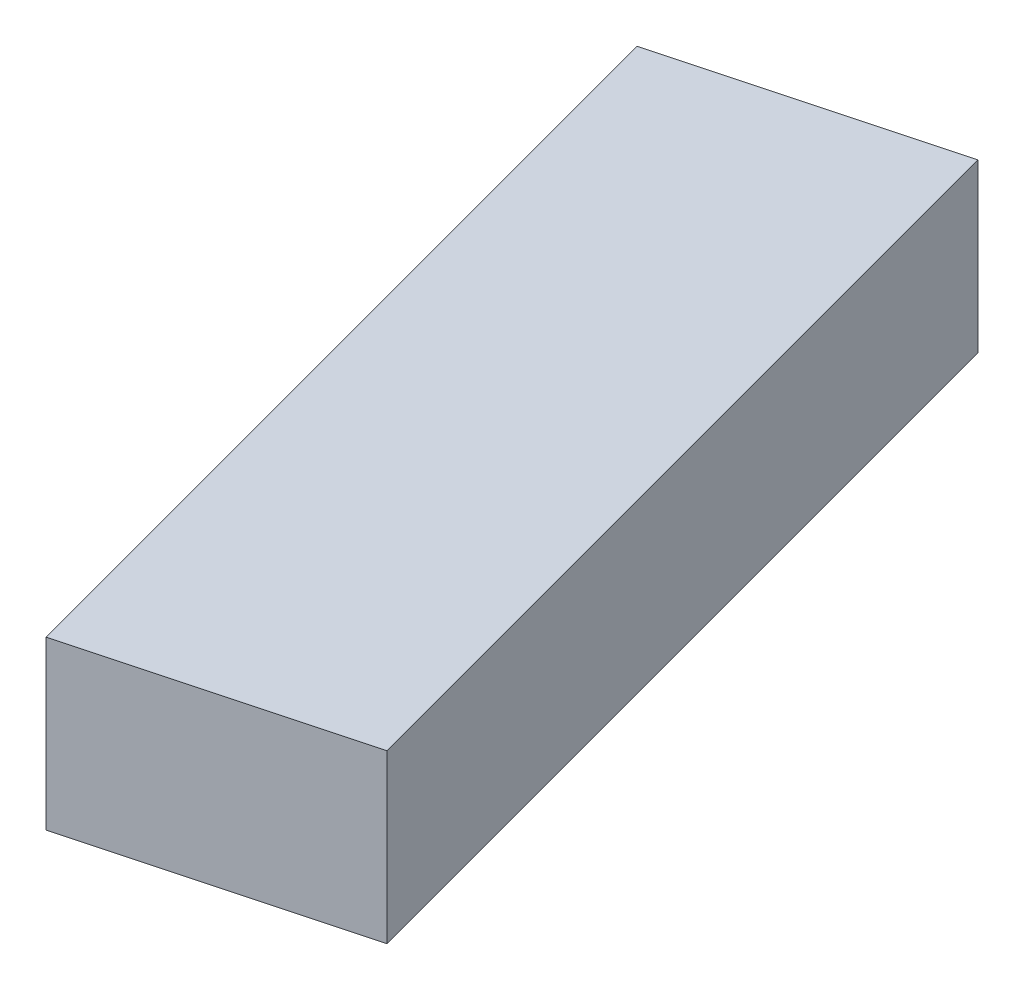
ISO-10303-21;
HEADER;
FILE_DESCRIPTION(('STEP AP214'),'2;1');
FILE_NAME('part.step','',(''),(''),'','','');
FILE_SCHEMA(('AUTOMOTIVE_DESIGN { 1 0 10303 214 1 1 1 1 }'));
ENDSEC;
DATA;
#1=APPLICATION_CONTEXT('core data for automotive mechanical design processes');
#2=APPLICATION_PROTOCOL_DEFINITION('international standard','automotive_design',2000,#1);
#3=PRODUCT_CONTEXT('',#1,'mechanical');
#4=PRODUCT('Part','Part','',(#3));
#5=PRODUCT_RELATED_PRODUCT_CATEGORY('part','',(#4));
#6=PRODUCT_DEFINITION_FORMATION('','',#4);
#7=PRODUCT_DEFINITION_CONTEXT('part definition',#1,'design');
#8=PRODUCT_DEFINITION('design','',#6,#7);
#9=PRODUCT_DEFINITION_SHAPE('','',#8);
#10=(LENGTH_UNIT() NAMED_UNIT(*) SI_UNIT(.MILLI.,.METRE.));
#11=(NAMED_UNIT(*) PLANE_ANGLE_UNIT() SI_UNIT($,.RADIAN.));
#12=(NAMED_UNIT(*) SI_UNIT($,.STERADIAN.) SOLID_ANGLE_UNIT());
#13=UNCERTAINTY_MEASURE_WITH_UNIT(LENGTH_MEASURE(1.E-05),#10,'distance_accuracy_value','');
#14=(GEOMETRIC_REPRESENTATION_CONTEXT(3) GLOBAL_UNCERTAINTY_ASSIGNED_CONTEXT((#13)) GLOBAL_UNIT_ASSIGNED_CONTEXT((#10,
#11,#12)) REPRESENTATION_CONTEXT('',''));
#15=CARTESIAN_POINT('',(0.,0.,0.));
#16=DIRECTION('',(0.,0.,1.));
#17=DIRECTION('',(1.,0.,0.));
#18=AXIS2_PLACEMENT_3D('',#15,#16,#17);
#19=CARTESIAN_POINT('',(-559.6441454894,-32.,2167.264260819));
#20=DIRECTION('',(0.258819045102985,0.,0.965925826288944));
#21=DIRECTION('',(0.,-1.,0.));
#22=AXIS2_PLACEMENT_3D('',#19,#20,#21);
#23=PLANE('',#22);
#24=DIRECTION('',(0.,1.,0.));
#25=VECTOR('',#24,1.);
#26=CARTESIAN_POINT('',(-559.6441454894,-32.,2167.264260819));
#27=LINE('',#26,#25);
#28=CARTESIAN_POINT('',(-559.6441454894,-32.,2167.264260819));
#29=VERTEX_POINT('',#28);
#30=CARTESIAN_POINT('',(-559.6441454894,-26.,2167.264260819));
#31=VERTEX_POINT('',#30);
#32=EDGE_CURVE('E70',#29,#31,#27,.T.);
#33=ORIENTED_EDGE('',*,*,#32,.F.);
#34=DIRECTION('',(0.965925826288944,0.,-0.258819045102985));
#35=VECTOR('',#34,1.);
#36=CARTESIAN_POINT('',(-559.6441454894,-32.,2167.264260819));
#37=LINE('',#36,#35);
#38=CARTESIAN_POINT('',(-549.9848872265,-32.,2164.676070368));
#39=VERTEX_POINT('',#38);
#40=EDGE_CURVE('E65',#29,#39,#37,.T.);
#41=ORIENTED_EDGE('',*,*,#40,.T.);
#42=DIRECTION('',(0.,1.,0.));
#43=VECTOR('',#42,1.);
#44=CARTESIAN_POINT('',(-549.9848872265,-32.,2164.676070368));
#45=LINE('',#44,#43);
#46=CARTESIAN_POINT('',(-549.9848872265,-26.,2164.676070368));
#47=VERTEX_POINT('',#46);
#48=EDGE_CURVE('E67',#39,#47,#45,.T.);
#49=ORIENTED_EDGE('',*,*,#48,.T.);
#50=DIRECTION('',(0.965925826288944,0.,-0.258819045102985));
#51=VECTOR('',#50,1.);
#52=CARTESIAN_POINT('',(-559.6441454894,-26.,2167.264260819));
#53=LINE('',#52,#51);
#54=EDGE_CURVE('E11',#31,#47,#53,.T.);
#55=ORIENTED_EDGE('',*,*,#54,.F.);
#56=EDGE_LOOP('',(#33,#41,#49,#55));
#57=FACE_BOUND('',#56,.T.);
#58=ADVANCED_FACE('F17',(#57),#23,.T.);
#59=CARTESIAN_POINT('',(-567.4087168425,-32.,2138.286486031));
#60=DIRECTION('',(0.258819045102985,0.,0.965925826288944));
#61=DIRECTION('',(0.,-1.,0.));
#62=AXIS2_PLACEMENT_3D('',#59,#60,#61);
#63=PLANE('',#62);
#64=DIRECTION('',(0.965925826288944,0.,-0.258819045102985));
#65=VECTOR('',#64,1.);
#66=CARTESIAN_POINT('',(-567.4087168425,-26.,2138.286486031));
#67=LINE('',#66,#65);
#68=CARTESIAN_POINT('',(-567.4087168425,-26.,2138.286486031));
#69=VERTEX_POINT('',#68);
#70=CARTESIAN_POINT('',(-557.7494585796,-26.,2135.69829558));
#71=VERTEX_POINT('',#70);
#72=EDGE_CURVE('E27',#69,#71,#67,.T.);
#73=ORIENTED_EDGE('',*,*,#72,.T.);
#74=DIRECTION('',(0.,1.,0.));
#75=VECTOR('',#74,1.);
#76=CARTESIAN_POINT('',(-557.7494585796,-32.,2135.69829558));
#77=LINE('',#76,#75);
#78=CARTESIAN_POINT('',(-557.7494585796,-32.,2135.69829558));
#79=VERTEX_POINT('',#78);
#80=EDGE_CURVE('E89',#79,#71,#77,.T.);
#81=ORIENTED_EDGE('',*,*,#80,.F.);
#82=DIRECTION('',(0.965925826288944,0.,-0.258819045102985));
#83=VECTOR('',#82,1.);
#84=CARTESIAN_POINT('',(-567.4087168425,-32.,2138.286486031));
#85=LINE('',#84,#83);
#86=CARTESIAN_POINT('',(-567.4087168425,-32.,2138.286486031));
#87=VERTEX_POINT('',#86);
#88=EDGE_CURVE('E76',#87,#79,#85,.T.);
#89=ORIENTED_EDGE('',*,*,#88,.F.);
#90=DIRECTION('',(0.,1.,0.));
#91=VECTOR('',#90,1.);
#92=CARTESIAN_POINT('',(-567.4087168425,-32.,2138.286486031));
#93=LINE('',#92,#91);
#94=EDGE_CURVE('E96',#87,#69,#93,.T.);
#95=ORIENTED_EDGE('',*,*,#94,.T.);
#96=EDGE_LOOP('',(#73,#81,#89,#95));
#97=FACE_BOUND('',#96,.T.);
#98=ADVANCED_FACE('F19',(#97),#63,.F.);
#99=CARTESIAN_POINT('',(-567.4087168425,-26.,2138.286486031));
#100=DIRECTION('',(0.,1.,0.));
#101=DIRECTION('',(1.,0.,0.));
#102=AXIS2_PLACEMENT_3D('',#99,#100,#101);
#103=PLANE('',#102);
#104=ORIENTED_EDGE('',*,*,#72,.F.);
#105=DIRECTION('',(0.258819045102985,0.,0.965925826288944));
#106=VECTOR('',#105,1.);
#107=CARTESIAN_POINT('',(-567.4087168425,-26.,2138.286486031));
#108=LINE('',#107,#106);
#109=EDGE_CURVE('E114',#69,#31,#108,.T.);
#110=ORIENTED_EDGE('',*,*,#109,.T.);
#111=ORIENTED_EDGE('',*,*,#54,.T.);
#112=DIRECTION('',(0.258819045102985,0.,0.965925826288944));
#113=VECTOR('',#112,1.);
#114=CARTESIAN_POINT('',(-557.7494585796,-26.,2135.69829558));
#115=LINE('',#114,#113);
#116=EDGE_CURVE('E83',#71,#47,#115,.T.);
#117=ORIENTED_EDGE('',*,*,#116,.F.);
#118=EDGE_LOOP('',(#104,#110,#111,#117));
#119=FACE_BOUND('',#118,.T.);
#120=ADVANCED_FACE('F107',(#119),#103,.T.);
#121=CARTESIAN_POINT('',(-567.4087168425,-32.,2138.286486031));
#122=DIRECTION('',(0.,1.,0.));
#123=DIRECTION('',(1.,0.,0.));
#124=AXIS2_PLACEMENT_3D('',#121,#122,#123);
#125=PLANE('',#124);
#126=DIRECTION('',(0.258819045102985,0.,0.965925826288944));
#127=VECTOR('',#126,1.);
#128=CARTESIAN_POINT('',(-557.7494585796,-32.,2135.69829558));
#129=LINE('',#128,#127);
#130=EDGE_CURVE('E82',#79,#39,#129,.T.);
#131=ORIENTED_EDGE('',*,*,#130,.T.);
#132=ORIENTED_EDGE('',*,*,#40,.F.);
#133=DIRECTION('',(0.258819045102985,0.,0.965925826288944));
#134=VECTOR('',#133,1.);
#135=CARTESIAN_POINT('',(-567.4087168425,-32.,2138.286486031));
#136=LINE('',#135,#134);
#137=EDGE_CURVE('E90',#87,#29,#136,.T.);
#138=ORIENTED_EDGE('',*,*,#137,.F.);
#139=ORIENTED_EDGE('',*,*,#88,.T.);
#140=EDGE_LOOP('',(#131,#132,#138,#139));
#141=FACE_BOUND('',#140,.T.);
#142=ADVANCED_FACE('F86',(#141),#125,.F.);
#143=CARTESIAN_POINT('',(-557.7494585796,-32.,2135.69829558));
#144=DIRECTION('',(0.965925826288944,0.,-0.258819045102985));
#145=DIRECTION('',(0.,-1.,0.));
#146=AXIS2_PLACEMENT_3D('',#143,#144,#145);
#147=PLANE('',#146);
#148=ORIENTED_EDGE('',*,*,#130,.F.);
#149=ORIENTED_EDGE('',*,*,#80,.T.);
#150=ORIENTED_EDGE('',*,*,#116,.T.);
#151=ORIENTED_EDGE('',*,*,#48,.F.);
#152=EDGE_LOOP('',(#148,#149,#150,#151));
#153=FACE_BOUND('',#152,.T.);
#154=ADVANCED_FACE('F80',(#153),#147,.T.);
#155=CARTESIAN_POINT('',(-567.4087168425,-32.,2138.286486031));
#156=DIRECTION('',(0.965925826288944,0.,-0.258819045102985));
#157=DIRECTION('',(0.,-1.,0.));
#158=AXIS2_PLACEMENT_3D('',#155,#156,#157);
#159=PLANE('',#158);
#160=ORIENTED_EDGE('',*,*,#32,.T.);
#161=ORIENTED_EDGE('',*,*,#109,.F.);
#162=ORIENTED_EDGE('',*,*,#94,.F.);
#163=ORIENTED_EDGE('',*,*,#137,.T.);
#164=EDGE_LOOP('',(#160,#161,#162,#163));
#165=FACE_BOUND('',#164,.T.);
#166=ADVANCED_FACE('F124',(#165),#159,.F.);
#167=CLOSED_SHELL('',(#58,#98,#120,#142,#154,#166));
#168=MANIFOLD_SOLID_BREP('B1',#167);
#169=ADVANCED_BREP_SHAPE_REPRESENTATION('',(#18,#168),#14);
#170=SHAPE_DEFINITION_REPRESENTATION(#9,#169);
ENDSEC;
END-ISO-10303-21;
